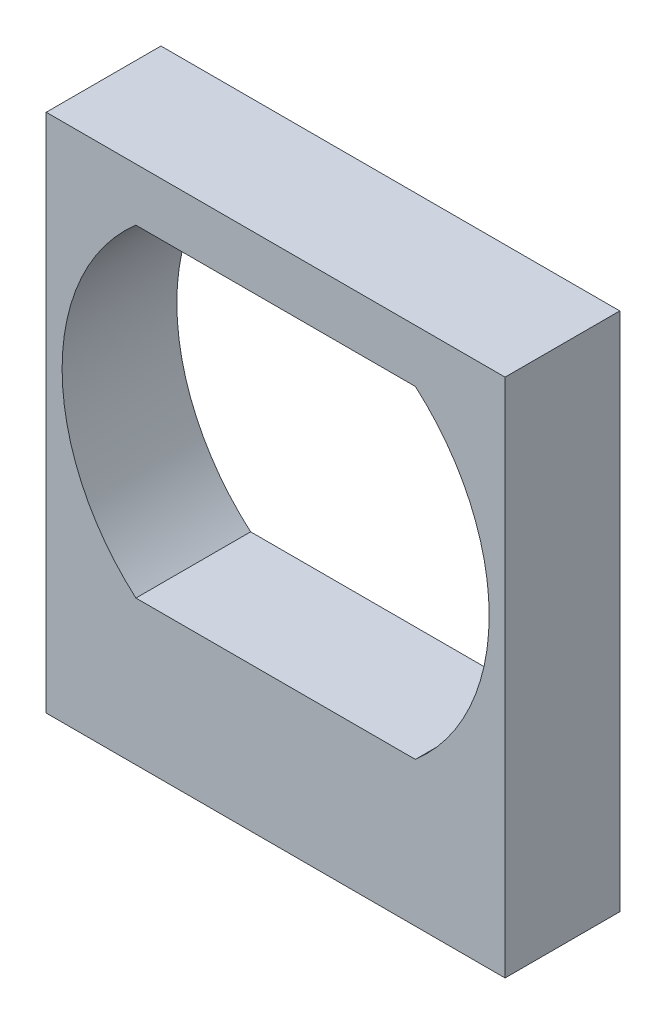
ISO-10303-21;
HEADER;
FILE_DESCRIPTION(('STEP AP214'),'2;1');
FILE_NAME('part.step','',(''),(''),'','','');
FILE_SCHEMA(('AUTOMOTIVE_DESIGN { 1 0 10303 214 1 1 1 1 }'));
ENDSEC;
DATA;
#1=APPLICATION_CONTEXT('core data for automotive mechanical design processes');
#2=APPLICATION_PROTOCOL_DEFINITION('international standard','automotive_design',2000,#1);
#3=PRODUCT_CONTEXT('',#1,'mechanical');
#4=PRODUCT('Part','Part','',(#3));
#5=PRODUCT_RELATED_PRODUCT_CATEGORY('part','',(#4));
#6=PRODUCT_DEFINITION_FORMATION('','',#4);
#7=PRODUCT_DEFINITION_CONTEXT('part definition',#1,'design');
#8=PRODUCT_DEFINITION('design','',#6,#7);
#9=PRODUCT_DEFINITION_SHAPE('','',#8);
#10=(LENGTH_UNIT() NAMED_UNIT(*) SI_UNIT(.MILLI.,.METRE.));
#11=(NAMED_UNIT(*) PLANE_ANGLE_UNIT() SI_UNIT($,.RADIAN.));
#12=(NAMED_UNIT(*) SI_UNIT($,.STERADIAN.) SOLID_ANGLE_UNIT());
#13=UNCERTAINTY_MEASURE_WITH_UNIT(LENGTH_MEASURE(1.E-05),#10,'distance_accuracy_value','');
#14=(GEOMETRIC_REPRESENTATION_CONTEXT(3) GLOBAL_UNCERTAINTY_ASSIGNED_CONTEXT((#13)) GLOBAL_UNIT_ASSIGNED_CONTEXT((#10,
#11,#12)) REPRESENTATION_CONTEXT('',''));
#15=CARTESIAN_POINT('',(0.,0.,0.));
#16=DIRECTION('',(0.,0.,1.));
#17=DIRECTION('',(1.,0.,0.));
#18=AXIS2_PLACEMENT_3D('',#15,#16,#17);
#19=CARTESIAN_POINT('',(0.,0.,6.5));
#20=DIRECTION('',(0.,0.,1.));
#21=DIRECTION('',(1.,0.,0.));
#22=AXIS2_PLACEMENT_3D('',#19,#20,#21);
#23=PLANE('',#22);
#24=DIRECTION('',(1.,0.,0.));
#25=VECTOR('',#24,1.);
#26=CARTESIAN_POINT('',(-13.,-17.337,6.5));
#27=LINE('',#26,#25);
#28=CARTESIAN_POINT('',(-13.,-17.337,6.5));
#29=VERTEX_POINT('',#28);
#30=CARTESIAN_POINT('',(13.,-17.337,6.5));
#31=VERTEX_POINT('',#30);
#32=EDGE_CURVE('E154',#29,#31,#27,.T.);
#33=ORIENTED_EDGE('',*,*,#32,.T.);
#34=DIRECTION('',(0.,1.,0.));
#35=VECTOR('',#34,1.);
#36=CARTESIAN_POINT('',(13.,-17.337,6.5));
#37=LINE('',#36,#35);
#38=CARTESIAN_POINT('',(13.,12.15,6.5));
#39=VERTEX_POINT('',#38);
#40=EDGE_CURVE('E157',#31,#39,#37,.T.);
#41=ORIENTED_EDGE('',*,*,#40,.T.);
#42=DIRECTION('',(-1.,0.,0.));
#43=VECTOR('',#42,1.);
#44=CARTESIAN_POINT('',(-13.,12.15,6.5));
#45=LINE('',#44,#43);
#46=CARTESIAN_POINT('',(-13.,12.15,6.5));
#47=VERTEX_POINT('',#46);
#48=EDGE_CURVE('E160',#39,#47,#45,.T.);
#49=ORIENTED_EDGE('',*,*,#48,.T.);
#50=DIRECTION('',(0.,-1.,0.));
#51=VECTOR('',#50,1.);
#52=CARTESIAN_POINT('',(-13.,-17.337,6.5));
#53=LINE('',#52,#51);
#54=EDGE_CURVE('E162',#47,#29,#53,.T.);
#55=ORIENTED_EDGE('',*,*,#54,.T.);
#56=EDGE_LOOP('',(#33,#41,#49,#55));
#57=FACE_BOUND('',#56,.T.);
#58=DIRECTION('',(-1.,0.,0.));
#59=VECTOR('',#58,1.);
#60=CARTESIAN_POINT('',(-7.91754381105656,9.15,6.5));
#61=LINE('',#60,#59);
#62=CARTESIAN_POINT('',(7.91754381105656,9.15,6.5));
#63=VERTEX_POINT('',#62);
#64=CARTESIAN_POINT('',(-7.91754381105656,9.15,6.5));
#65=VERTEX_POINT('',#64);
#66=EDGE_CURVE('E132',#63,#65,#61,.T.);
#67=ORIENTED_EDGE('',*,*,#66,.F.);
#68=CARTESIAN_POINT('',(0.,0.,6.5));
#69=DIRECTION('',(0.,0.,1.));
#70=DIRECTION('',(1.,0.,0.));
#71=AXIS2_PLACEMENT_3D('',#68,#69,#70);
#72=CIRCLE('',#71,12.1);
#73=CARTESIAN_POINT('',(7.91754381105656,-9.15,6.5));
#74=VERTEX_POINT('',#73);
#75=EDGE_CURVE('E130',#74,#63,#72,.T.);
#76=ORIENTED_EDGE('',*,*,#75,.F.);
#77=DIRECTION('',(1.,0.,0.));
#78=VECTOR('',#77,1.);
#79=CARTESIAN_POINT('',(-7.91754381105656,-9.15,6.5));
#80=LINE('',#79,#78);
#81=CARTESIAN_POINT('',(-7.91754381105656,-9.15,6.5));
#82=VERTEX_POINT('',#81);
#83=EDGE_CURVE('E137',#82,#74,#80,.T.);
#84=ORIENTED_EDGE('',*,*,#83,.F.);
#85=CARTESIAN_POINT('',(0.,0.,6.5));
#86=DIRECTION('',(0.,0.,1.));
#87=DIRECTION('',(1.,0.,0.));
#88=AXIS2_PLACEMENT_3D('',#85,#86,#87);
#89=CIRCLE('',#88,12.1);
#90=EDGE_CURVE('E135',#65,#82,#89,.T.);
#91=ORIENTED_EDGE('',*,*,#90,.F.);
#92=EDGE_LOOP('',(#67,#76,#84,#91));
#93=FACE_BOUND('',#92,.T.);
#94=ADVANCED_FACE('F45',(#57,#93),#23,.T.);
#95=CARTESIAN_POINT('',(0.,0.,0.));
#96=DIRECTION('',(0.,0.,1.));
#97=DIRECTION('',(1.,0.,0.));
#98=AXIS2_PLACEMENT_3D('',#95,#96,#97);
#99=PLANE('',#98);
#100=DIRECTION('',(1.,0.,0.));
#101=VECTOR('',#100,1.);
#102=CARTESIAN_POINT('',(-13.,-17.337,0.));
#103=LINE('',#102,#101);
#104=CARTESIAN_POINT('',(-13.,-17.337,0.));
#105=VERTEX_POINT('',#104);
#106=CARTESIAN_POINT('',(13.,-17.337,0.));
#107=VERTEX_POINT('',#106);
#108=EDGE_CURVE('E153',#105,#107,#103,.T.);
#109=ORIENTED_EDGE('',*,*,#108,.F.);
#110=DIRECTION('',(0.,-1.,0.));
#111=VECTOR('',#110,1.);
#112=CARTESIAN_POINT('',(-13.,-17.337,0.));
#113=LINE('',#112,#111);
#114=CARTESIAN_POINT('',(-13.,12.15,0.));
#115=VERTEX_POINT('',#114);
#116=EDGE_CURVE('E158',#115,#105,#113,.T.);
#117=ORIENTED_EDGE('',*,*,#116,.F.);
#118=DIRECTION('',(-1.,0.,0.));
#119=VECTOR('',#118,1.);
#120=CARTESIAN_POINT('',(-13.,12.15,0.));
#121=LINE('',#120,#119);
#122=CARTESIAN_POINT('',(13.,12.15,0.));
#123=VERTEX_POINT('',#122);
#124=EDGE_CURVE('E169',#123,#115,#121,.T.);
#125=ORIENTED_EDGE('',*,*,#124,.F.);
#126=DIRECTION('',(0.,1.,0.));
#127=VECTOR('',#126,1.);
#128=CARTESIAN_POINT('',(13.,-17.337,0.));
#129=LINE('',#128,#127);
#130=EDGE_CURVE('E167',#107,#123,#129,.T.);
#131=ORIENTED_EDGE('',*,*,#130,.F.);
#132=EDGE_LOOP('',(#109,#117,#125,#131));
#133=FACE_BOUND('',#132,.T.);
#134=CARTESIAN_POINT('',(0.,0.,0.));
#135=DIRECTION('',(0.,0.,1.));
#136=DIRECTION('',(1.,0.,0.));
#137=AXIS2_PLACEMENT_3D('',#134,#135,#136);
#138=CIRCLE('',#137,12.1);
#139=CARTESIAN_POINT('',(7.91754381105656,-9.15,0.));
#140=VERTEX_POINT('',#139);
#141=CARTESIAN_POINT('',(7.91754381105656,9.15,0.));
#142=VERTEX_POINT('',#141);
#143=EDGE_CURVE('E68',#140,#142,#138,.T.);
#144=ORIENTED_EDGE('',*,*,#143,.T.);
#145=DIRECTION('',(-1.,0.,0.));
#146=VECTOR('',#145,1.);
#147=CARTESIAN_POINT('',(-7.91754381105656,9.15,0.));
#148=LINE('',#147,#146);
#149=CARTESIAN_POINT('',(-7.91754381105656,9.15,0.));
#150=VERTEX_POINT('',#149);
#151=EDGE_CURVE('E125',#142,#150,#148,.T.);
#152=ORIENTED_EDGE('',*,*,#151,.T.);
#153=CARTESIAN_POINT('',(0.,0.,0.));
#154=DIRECTION('',(0.,0.,1.));
#155=DIRECTION('',(1.,0.,0.));
#156=AXIS2_PLACEMENT_3D('',#153,#154,#155);
#157=CIRCLE('',#156,12.1);
#158=CARTESIAN_POINT('',(-7.91754381105656,-9.15,0.));
#159=VERTEX_POINT('',#158);
#160=EDGE_CURVE('E142',#150,#159,#157,.T.);
#161=ORIENTED_EDGE('',*,*,#160,.T.);
#162=DIRECTION('',(1.,0.,0.));
#163=VECTOR('',#162,1.);
#164=CARTESIAN_POINT('',(-7.91754381105656,-9.15,0.));
#165=LINE('',#164,#163);
#166=EDGE_CURVE('E133',#159,#140,#165,.T.);
#167=ORIENTED_EDGE('',*,*,#166,.T.);
#168=EDGE_LOOP('',(#144,#152,#161,#167));
#169=FACE_BOUND('',#168,.T.);
#170=ADVANCED_FACE('F187',(#133,#169),#99,.F.);
#171=CARTESIAN_POINT('',(-13.,-17.337,6.5));
#172=DIRECTION('',(0.,1.,0.));
#173=DIRECTION('',(0.,0.,1.));
#174=AXIS2_PLACEMENT_3D('',#171,#172,#173);
#175=PLANE('',#174);
#176=CARTESIAN_POINT('',(0.,-17.337,3.25));
#177=DIRECTION('',(0.,-1.,0.));
#178=DIRECTION('',(0.,0.,-1.));
#179=AXIS2_PLACEMENT_3D('',#176,#177,#178);
#180=CIRCLE('',#179,0.799999999999994);
#181=CARTESIAN_POINT('',(0.,-17.337,2.45000000000001));
#182=VERTEX_POINT('',#181);
#183=EDGE_CURVE('E123',#182,#182,#180,.T.);
#184=ORIENTED_EDGE('',*,*,#183,.F.);
#185=EDGE_LOOP('',(#184));
#186=FACE_BOUND('',#185,.T.);
#187=ORIENTED_EDGE('',*,*,#108,.T.);
#188=DIRECTION('',(0.,0.,-1.));
#189=VECTOR('',#188,1.);
#190=CARTESIAN_POINT('',(13.,-17.337,6.5));
#191=LINE('',#190,#189);
#192=EDGE_CURVE('E11',#31,#107,#191,.T.);
#193=ORIENTED_EDGE('',*,*,#192,.F.);
#194=ORIENTED_EDGE('',*,*,#32,.F.);
#195=DIRECTION('',(0.,0.,-1.));
#196=VECTOR('',#195,1.);
#197=CARTESIAN_POINT('',(-13.,-17.337,6.5));
#198=LINE('',#197,#196);
#199=EDGE_CURVE('E164',#29,#105,#198,.T.);
#200=ORIENTED_EDGE('',*,*,#199,.T.);
#201=EDGE_LOOP('',(#187,#193,#194,#200));
#202=FACE_BOUND('',#201,.T.);
#203=ADVANCED_FACE('F47',(#186,#202),#175,.F.);
#204=CARTESIAN_POINT('',(13.,-17.337,6.5));
#205=DIRECTION('',(-1.,0.,0.));
#206=DIRECTION('',(0.,0.,1.));
#207=AXIS2_PLACEMENT_3D('',#204,#205,#206);
#208=PLANE('',#207);
#209=ORIENTED_EDGE('',*,*,#130,.T.);
#210=DIRECTION('',(0.,0.,-1.));
#211=VECTOR('',#210,1.);
#212=CARTESIAN_POINT('',(13.,12.15,6.5));
#213=LINE('',#212,#211);
#214=EDGE_CURVE('E53',#39,#123,#213,.T.);
#215=ORIENTED_EDGE('',*,*,#214,.F.);
#216=ORIENTED_EDGE('',*,*,#40,.F.);
#217=ORIENTED_EDGE('',*,*,#192,.T.);
#218=EDGE_LOOP('',(#209,#215,#216,#217));
#219=FACE_BOUND('',#218,.T.);
#220=ADVANCED_FACE('F198',(#219),#208,.F.);
#221=CARTESIAN_POINT('',(-13.,12.15,6.5));
#222=DIRECTION('',(0.,-1.,0.));
#223=DIRECTION('',(0.,0.,-1.));
#224=AXIS2_PLACEMENT_3D('',#221,#222,#223);
#225=PLANE('',#224);
#226=ORIENTED_EDGE('',*,*,#124,.T.);
#227=DIRECTION('',(0.,0.,-1.));
#228=VECTOR('',#227,1.);
#229=CARTESIAN_POINT('',(-13.,12.15,6.5));
#230=LINE('',#229,#228);
#231=EDGE_CURVE('E174',#47,#115,#230,.T.);
#232=ORIENTED_EDGE('',*,*,#231,.F.);
#233=ORIENTED_EDGE('',*,*,#48,.F.);
#234=ORIENTED_EDGE('',*,*,#214,.T.);
#235=EDGE_LOOP('',(#226,#232,#233,#234));
#236=FACE_BOUND('',#235,.T.);
#237=ADVANCED_FACE('F181',(#236),#225,.F.);
#238=CARTESIAN_POINT('',(-13.,-17.337,6.5));
#239=DIRECTION('',(1.,0.,0.));
#240=DIRECTION('',(0.,0.,-1.));
#241=AXIS2_PLACEMENT_3D('',#238,#239,#240);
#242=PLANE('',#241);
#243=ORIENTED_EDGE('',*,*,#116,.T.);
#244=ORIENTED_EDGE('',*,*,#199,.F.);
#245=ORIENTED_EDGE('',*,*,#54,.F.);
#246=ORIENTED_EDGE('',*,*,#231,.T.);
#247=EDGE_LOOP('',(#243,#244,#245,#246));
#248=FACE_BOUND('',#247,.T.);
#249=ADVANCED_FACE('F191',(#248),#242,.F.);
#250=CARTESIAN_POINT('',(0.,0.,6.5));
#251=DIRECTION('',(0.,0.,-1.));
#252=DIRECTION('',(-1.,0.,0.));
#253=AXIS2_PLACEMENT_3D('',#250,#251,#252);
#254=CYLINDRICAL_SURFACE('',#253,12.1);
#255=ORIENTED_EDGE('',*,*,#143,.F.);
#256=DIRECTION('',(0.,0.,-1.));
#257=VECTOR('',#256,1.);
#258=CARTESIAN_POINT('',(7.91754381105656,-9.15,6.5));
#259=LINE('',#258,#257);
#260=EDGE_CURVE('E138',#74,#140,#259,.T.);
#261=ORIENTED_EDGE('',*,*,#260,.F.);
#262=ORIENTED_EDGE('',*,*,#75,.T.);
#263=DIRECTION('',(0.,0.,-1.));
#264=VECTOR('',#263,1.);
#265=CARTESIAN_POINT('',(7.91754381105656,9.15,6.5));
#266=LINE('',#265,#264);
#267=EDGE_CURVE('E151',#63,#142,#266,.T.);
#268=ORIENTED_EDGE('',*,*,#267,.T.);
#269=EDGE_LOOP('',(#255,#261,#262,#268));
#270=FACE_BOUND('',#269,.T.);
#271=ADVANCED_FACE('F214',(#270),#254,.F.);
#272=CARTESIAN_POINT('',(-7.91754381105656,9.15,6.5));
#273=DIRECTION('',(0.,-1.,0.));
#274=DIRECTION('',(1.,0.,0.));
#275=AXIS2_PLACEMENT_3D('',#272,#273,#274);
#276=PLANE('',#275);
#277=ORIENTED_EDGE('',*,*,#151,.F.);
#278=ORIENTED_EDGE('',*,*,#267,.F.);
#279=ORIENTED_EDGE('',*,*,#66,.T.);
#280=DIRECTION('',(0.,0.,-1.));
#281=VECTOR('',#280,1.);
#282=CARTESIAN_POINT('',(-7.91754381105656,9.15,6.5));
#283=LINE('',#282,#281);
#284=EDGE_CURVE('E149',#65,#150,#283,.T.);
#285=ORIENTED_EDGE('',*,*,#284,.T.);
#286=EDGE_LOOP('',(#277,#278,#279,#285));
#287=FACE_BOUND('',#286,.T.);
#288=ADVANCED_FACE('F220',(#287),#276,.T.);
#289=CARTESIAN_POINT('',(0.,0.,6.5));
#290=DIRECTION('',(0.,0.,-1.));
#291=DIRECTION('',(-1.,0.,0.));
#292=AXIS2_PLACEMENT_3D('',#289,#290,#291);
#293=CYLINDRICAL_SURFACE('',#292,12.1);
#294=ORIENTED_EDGE('',*,*,#160,.F.);
#295=ORIENTED_EDGE('',*,*,#284,.F.);
#296=ORIENTED_EDGE('',*,*,#90,.T.);
#297=DIRECTION('',(0.,0.,-1.));
#298=VECTOR('',#297,1.);
#299=CARTESIAN_POINT('',(-7.91754381105656,-9.15,6.5));
#300=LINE('',#299,#298);
#301=EDGE_CURVE('E60',#82,#159,#300,.T.);
#302=ORIENTED_EDGE('',*,*,#301,.T.);
#303=EDGE_LOOP('',(#294,#295,#296,#302));
#304=FACE_BOUND('',#303,.T.);
#305=ADVANCED_FACE('F224',(#304),#293,.F.);
#306=CARTESIAN_POINT('',(-7.91754381105656,-9.15,6.5));
#307=DIRECTION('',(0.,1.,0.));
#308=DIRECTION('',(-1.,0.,0.));
#309=AXIS2_PLACEMENT_3D('',#306,#307,#308);
#310=PLANE('',#309);
#311=ORIENTED_EDGE('',*,*,#166,.F.);
#312=ORIENTED_EDGE('',*,*,#301,.F.);
#313=ORIENTED_EDGE('',*,*,#83,.T.);
#314=ORIENTED_EDGE('',*,*,#260,.T.);
#315=EDGE_LOOP('',(#311,#312,#313,#314));
#316=FACE_BOUND('',#315,.T.);
#317=ADVANCED_FACE('F117',(#316),#310,.T.);
#318=CARTESIAN_POINT('',(0.,-12.137,3.25));
#319=DIRECTION('',(0.,-1.,0.));
#320=DIRECTION('',(0.,0.,-1.));
#321=AXIS2_PLACEMENT_3D('',#318,#319,#320);
#322=CONICAL_SURFACE('',#321,0.799999999999993,1.02974425867665);
#323=CARTESIAN_POINT('',(0.,-11.6563115047779,3.25));
#324=VERTEX_POINT('',#323);
#325=VERTEX_LOOP('',#324);
#326=FACE_BOUND('',#325,.T.);
#327=CARTESIAN_POINT('',(0.,-12.137,3.25));
#328=DIRECTION('',(0.,-1.,0.));
#329=DIRECTION('',(0.,0.,-1.));
#330=AXIS2_PLACEMENT_3D('',#327,#328,#329);
#331=CIRCLE('',#330,0.799999999999993);
#332=CARTESIAN_POINT('',(0.,-12.137,2.45000000000001));
#333=VERTEX_POINT('',#332);
#334=EDGE_CURVE('E121',#333,#333,#331,.T.);
#335=ORIENTED_EDGE('',*,*,#334,.T.);
#336=EDGE_LOOP('',(#335));
#337=FACE_BOUND('',#336,.T.);
#338=ADVANCED_FACE('F113',(#326,#337),#322,.F.);
#339=CARTESIAN_POINT('',(0.,-17.337,3.25));
#340=DIRECTION('',(0.,-1.,0.));
#341=DIRECTION('',(0.,0.,-1.));
#342=AXIS2_PLACEMENT_3D('',#339,#340,#341);
#343=CYLINDRICAL_SURFACE('',#342,0.799999999999994);
#344=ORIENTED_EDGE('',*,*,#334,.F.);
#345=EDGE_LOOP('',(#344));
#346=FACE_BOUND('',#345,.T.);
#347=ORIENTED_EDGE('',*,*,#183,.T.);
#348=EDGE_LOOP('',(#347));
#349=FACE_BOUND('',#348,.T.);
#350=ADVANCED_FACE('F116',(#346,#349),#343,.F.);
#351=CLOSED_SHELL('',(#94,#170,#203,#220,#237,#249,#271,#288,#305,#317,#338,#350));
#352=MANIFOLD_SOLID_BREP('B2',#351);
#353=ADVANCED_BREP_SHAPE_REPRESENTATION('',(#18,#352),#14);
#354=SHAPE_DEFINITION_REPRESENTATION(#9,#353);
ENDSEC;
END-ISO-10303-21;
